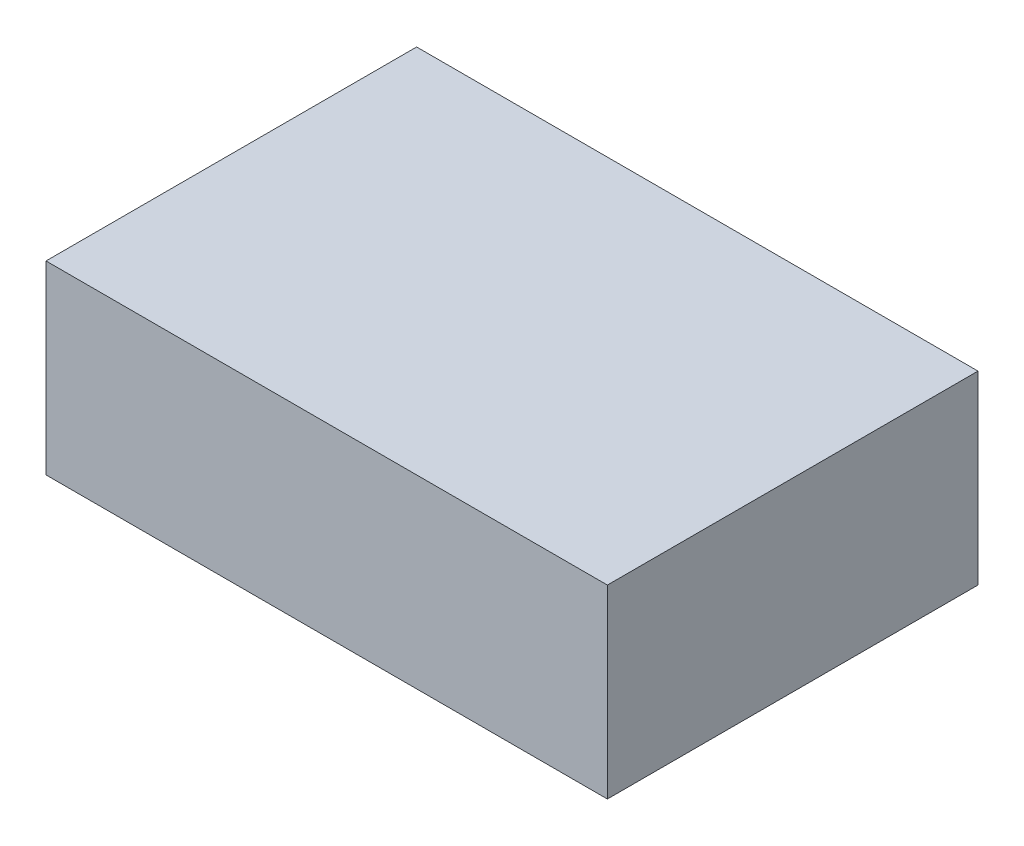
ISO-10303-21;
HEADER;
FILE_DESCRIPTION(('STEP AP214'),'2;1');
FILE_NAME('part.step','',(''),(''),'','','');
FILE_SCHEMA(('AUTOMOTIVE_DESIGN { 1 0 10303 214 1 1 1 1 }'));
ENDSEC;
DATA;
#1=APPLICATION_CONTEXT('core data for automotive mechanical design processes');
#2=APPLICATION_PROTOCOL_DEFINITION('international standard','automotive_design',2000,#1);
#3=PRODUCT_CONTEXT('',#1,'mechanical');
#4=PRODUCT('Part','Part','',(#3));
#5=PRODUCT_RELATED_PRODUCT_CATEGORY('part','',(#4));
#6=PRODUCT_DEFINITION_FORMATION('','',#4);
#7=PRODUCT_DEFINITION_CONTEXT('part definition',#1,'design');
#8=PRODUCT_DEFINITION('design','',#6,#7);
#9=PRODUCT_DEFINITION_SHAPE('','',#8);
#10=(LENGTH_UNIT() NAMED_UNIT(*) SI_UNIT(.MILLI.,.METRE.));
#11=(NAMED_UNIT(*) PLANE_ANGLE_UNIT() SI_UNIT($,.RADIAN.));
#12=(NAMED_UNIT(*) SI_UNIT($,.STERADIAN.) SOLID_ANGLE_UNIT());
#13=UNCERTAINTY_MEASURE_WITH_UNIT(LENGTH_MEASURE(1.E-05),#10,'distance_accuracy_value','');
#14=(GEOMETRIC_REPRESENTATION_CONTEXT(3) GLOBAL_UNCERTAINTY_ASSIGNED_CONTEXT((#13)) GLOBAL_UNIT_ASSIGNED_CONTEXT((#10,
#11,#12)) REPRESENTATION_CONTEXT('',''));
#15=CARTESIAN_POINT('',(0.,0.,0.));
#16=DIRECTION('',(0.,0.,1.));
#17=DIRECTION('',(1.,0.,0.));
#18=AXIS2_PLACEMENT_3D('',#15,#16,#17);
#19=CARTESIAN_POINT('',(0.,86.36,0.));
#20=DIRECTION('',(-1.,0.,0.));
#21=DIRECTION('',(0.,0.,1.));
#22=AXIS2_PLACEMENT_3D('',#19,#20,#21);
#23=PLANE('',#22);
#24=DIRECTION('',(0.,0.,-1.));
#25=VECTOR('',#24,1.);
#26=CARTESIAN_POINT('',(0.,0.,0.));
#27=LINE('',#26,#25);
#28=CARTESIAN_POINT('',(0.,0.,0.));
#29=VERTEX_POINT('',#28);
#30=CARTESIAN_POINT('',(0.,0.,-172.72));
#31=VERTEX_POINT('',#30);
#32=EDGE_CURVE('E101',#29,#31,#27,.T.);
#33=ORIENTED_EDGE('',*,*,#32,.F.);
#34=DIRECTION('',(0.,-1.,0.));
#35=VECTOR('',#34,1.);
#36=CARTESIAN_POINT('',(0.,86.36,0.));
#37=LINE('',#36,#35);
#38=CARTESIAN_POINT('',(0.,86.36,0.));
#39=VERTEX_POINT('',#38);
#40=EDGE_CURVE('E11',#39,#29,#37,.T.);
#41=ORIENTED_EDGE('',*,*,#40,.F.);
#42=DIRECTION('',(0.,0.,-1.));
#43=VECTOR('',#42,1.);
#44=CARTESIAN_POINT('',(0.,86.36,0.));
#45=LINE('',#44,#43);
#46=CARTESIAN_POINT('',(0.,86.36,-172.72));
#47=VERTEX_POINT('',#46);
#48=EDGE_CURVE('E96',#39,#47,#45,.T.);
#49=ORIENTED_EDGE('',*,*,#48,.T.);
#50=DIRECTION('',(0.,-1.,0.));
#51=VECTOR('',#50,1.);
#52=CARTESIAN_POINT('',(0.,86.36,-172.72));
#53=LINE('',#52,#51);
#54=EDGE_CURVE('E39',#47,#31,#53,.T.);
#55=ORIENTED_EDGE('',*,*,#54,.T.);
#56=EDGE_LOOP('',(#33,#41,#49,#55));
#57=FACE_BOUND('',#56,.T.);
#58=ADVANCED_FACE('F36',(#57),#23,.T.);
#59=CARTESIAN_POINT('',(0.,86.36,0.));
#60=DIRECTION('',(0.,0.,-1.));
#61=DIRECTION('',(-1.,0.,0.));
#62=AXIS2_PLACEMENT_3D('',#59,#60,#61);
#63=PLANE('',#62);
#64=DIRECTION('',(1.,0.,0.));
#65=VECTOR('',#64,1.);
#66=CARTESIAN_POINT('',(0.,0.,0.));
#67=LINE('',#66,#65);
#68=CARTESIAN_POINT('',(261.62,0.,0.));
#69=VERTEX_POINT('',#68);
#70=EDGE_CURVE('E69',#29,#69,#67,.T.);
#71=ORIENTED_EDGE('',*,*,#70,.T.);
#72=DIRECTION('',(0.,-1.,0.));
#73=VECTOR('',#72,1.);
#74=CARTESIAN_POINT('',(261.62,86.36,0.));
#75=LINE('',#74,#73);
#76=CARTESIAN_POINT('',(261.62,86.36,0.));
#77=VERTEX_POINT('',#76);
#78=EDGE_CURVE('E45',#77,#69,#75,.T.);
#79=ORIENTED_EDGE('',*,*,#78,.F.);
#80=DIRECTION('',(1.,0.,0.));
#81=VECTOR('',#80,1.);
#82=CARTESIAN_POINT('',(0.,86.36,0.));
#83=LINE('',#82,#81);
#84=EDGE_CURVE('E86',#39,#77,#83,.T.);
#85=ORIENTED_EDGE('',*,*,#84,.F.);
#86=ORIENTED_EDGE('',*,*,#40,.T.);
#87=EDGE_LOOP('',(#71,#79,#85,#86));
#88=FACE_BOUND('',#87,.T.);
#89=ADVANCED_FACE('F111',(#88),#63,.F.);
#90=CARTESIAN_POINT('',(261.62,86.36,0.));
#91=DIRECTION('',(-1.,0.,0.));
#92=DIRECTION('',(0.,0.,1.));
#93=AXIS2_PLACEMENT_3D('',#90,#91,#92);
#94=PLANE('',#93);
#95=DIRECTION('',(0.,0.,-1.));
#96=VECTOR('',#95,1.);
#97=CARTESIAN_POINT('',(261.62,0.,0.));
#98=LINE('',#97,#96);
#99=CARTESIAN_POINT('',(261.62,0.,-172.72));
#100=VERTEX_POINT('',#99);
#101=EDGE_CURVE('E93',#69,#100,#98,.T.);
#102=ORIENTED_EDGE('',*,*,#101,.T.);
#103=DIRECTION('',(0.,-1.,0.));
#104=VECTOR('',#103,1.);
#105=CARTESIAN_POINT('',(261.62,86.36,-172.72));
#106=LINE('',#105,#104);
#107=CARTESIAN_POINT('',(261.62,86.36,-172.72));
#108=VERTEX_POINT('',#107);
#109=EDGE_CURVE('E90',#108,#100,#106,.T.);
#110=ORIENTED_EDGE('',*,*,#109,.F.);
#111=DIRECTION('',(0.,0.,-1.));
#112=VECTOR('',#111,1.);
#113=CARTESIAN_POINT('',(261.62,86.36,0.));
#114=LINE('',#113,#112);
#115=EDGE_CURVE('E81',#77,#108,#114,.T.);
#116=ORIENTED_EDGE('',*,*,#115,.F.);
#117=ORIENTED_EDGE('',*,*,#78,.T.);
#118=EDGE_LOOP('',(#102,#110,#116,#117));
#119=FACE_BOUND('',#118,.T.);
#120=ADVANCED_FACE('F91',(#119),#94,.F.);
#121=CARTESIAN_POINT('',(0.,86.36,-172.72));
#122=DIRECTION('',(0.,0.,-1.));
#123=DIRECTION('',(-1.,0.,0.));
#124=AXIS2_PLACEMENT_3D('',#121,#122,#123);
#125=PLANE('',#124);
#126=DIRECTION('',(1.,0.,0.));
#127=VECTOR('',#126,1.);
#128=CARTESIAN_POINT('',(0.,0.,-172.72));
#129=LINE('',#128,#127);
#130=EDGE_CURVE('E104',#31,#100,#129,.T.);
#131=ORIENTED_EDGE('',*,*,#130,.F.);
#132=ORIENTED_EDGE('',*,*,#54,.F.);
#133=DIRECTION('',(1.,0.,0.));
#134=VECTOR('',#133,1.);
#135=CARTESIAN_POINT('',(0.,86.36,-172.72));
#136=LINE('',#135,#134);
#137=EDGE_CURVE('E85',#47,#108,#136,.T.);
#138=ORIENTED_EDGE('',*,*,#137,.T.);
#139=ORIENTED_EDGE('',*,*,#109,.T.);
#140=EDGE_LOOP('',(#131,#132,#138,#139));
#141=FACE_BOUND('',#140,.T.);
#142=ADVANCED_FACE('F95',(#141),#125,.T.);
#143=CARTESIAN_POINT('',(0.,86.36,0.));
#144=DIRECTION('',(0.,-1.,0.));
#145=DIRECTION('',(0.,0.,-1.));
#146=AXIS2_PLACEMENT_3D('',#143,#144,#145);
#147=PLANE('',#146);
#148=ORIENTED_EDGE('',*,*,#48,.F.);
#149=ORIENTED_EDGE('',*,*,#84,.T.);
#150=ORIENTED_EDGE('',*,*,#115,.T.);
#151=ORIENTED_EDGE('',*,*,#137,.F.);
#152=EDGE_LOOP('',(#148,#149,#150,#151));
#153=FACE_BOUND('',#152,.T.);
#154=ADVANCED_FACE('F84',(#153),#147,.F.);
#155=CARTESIAN_POINT('',(0.,0.,0.));
#156=DIRECTION('',(0.,-1.,0.));
#157=DIRECTION('',(0.,0.,-1.));
#158=AXIS2_PLACEMENT_3D('',#155,#156,#157);
#159=PLANE('',#158);
#160=ORIENTED_EDGE('',*,*,#32,.T.);
#161=ORIENTED_EDGE('',*,*,#130,.T.);
#162=ORIENTED_EDGE('',*,*,#101,.F.);
#163=ORIENTED_EDGE('',*,*,#70,.F.);
#164=EDGE_LOOP('',(#160,#161,#162,#163));
#165=FACE_BOUND('',#164,.T.);
#166=ADVANCED_FACE('F109',(#165),#159,.T.);
#167=CLOSED_SHELL('',(#58,#89,#120,#142,#154,#166));
#168=MANIFOLD_SOLID_BREP('B2',#167);
#169=ADVANCED_BREP_SHAPE_REPRESENTATION('',(#18,#168),#14);
#170=SHAPE_DEFINITION_REPRESENTATION(#9,#169);
ENDSEC;
END-ISO-10303-21;
